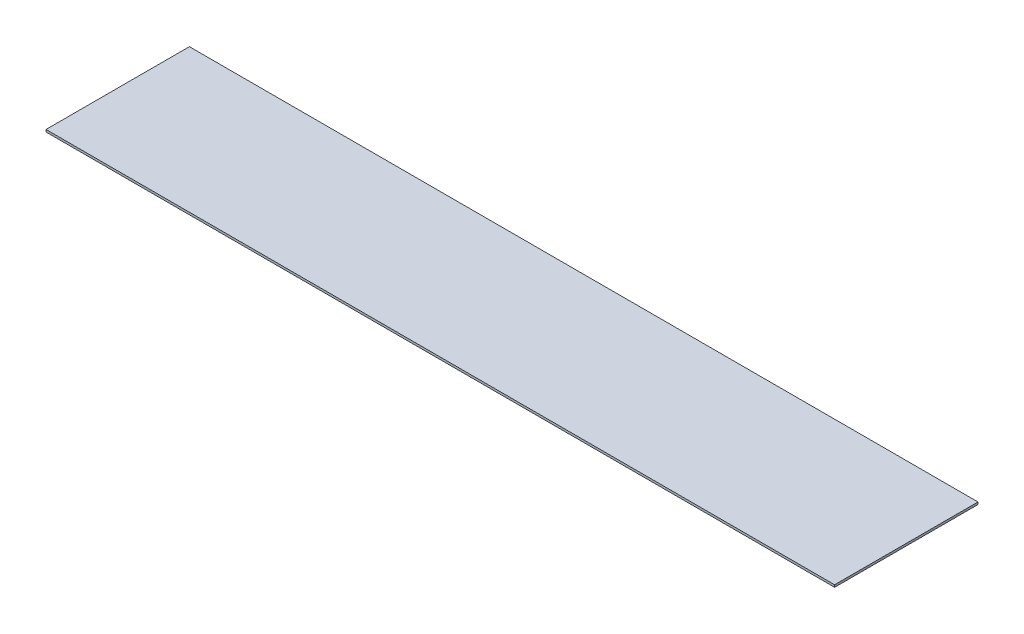
ISO-10303-21;
HEADER;
FILE_DESCRIPTION(('STEP AP214'),'2;1');
FILE_NAME('part.step','',(''),(''),'','','');
FILE_SCHEMA(('AUTOMOTIVE_DESIGN { 1 0 10303 214 1 1 1 1 }'));
ENDSEC;
DATA;
#1=APPLICATION_CONTEXT('core data for automotive mechanical design processes');
#2=APPLICATION_PROTOCOL_DEFINITION('international standard','automotive_design',2000,#1);
#3=PRODUCT_CONTEXT('',#1,'mechanical');
#4=PRODUCT('Part','Part','',(#3));
#5=PRODUCT_RELATED_PRODUCT_CATEGORY('part','',(#4));
#6=PRODUCT_DEFINITION_FORMATION('','',#4);
#7=PRODUCT_DEFINITION_CONTEXT('part definition',#1,'design');
#8=PRODUCT_DEFINITION('design','',#6,#7);
#9=PRODUCT_DEFINITION_SHAPE('','',#8);
#10=(LENGTH_UNIT() NAMED_UNIT(*) SI_UNIT(.MILLI.,.METRE.));
#11=(NAMED_UNIT(*) PLANE_ANGLE_UNIT() SI_UNIT($,.RADIAN.));
#12=(NAMED_UNIT(*) SI_UNIT($,.STERADIAN.) SOLID_ANGLE_UNIT());
#13=UNCERTAINTY_MEASURE_WITH_UNIT(LENGTH_MEASURE(1.E-05),#10,'distance_accuracy_value','');
#14=(GEOMETRIC_REPRESENTATION_CONTEXT(3) GLOBAL_UNCERTAINTY_ASSIGNED_CONTEXT((#13)) GLOBAL_UNIT_ASSIGNED_CONTEXT((#10,
#11,#12)) REPRESENTATION_CONTEXT('',''));
#15=CARTESIAN_POINT('',(0.,0.,0.));
#16=DIRECTION('',(0.,0.,1.));
#17=DIRECTION('',(1.,0.,0.));
#18=AXIS2_PLACEMENT_3D('',#15,#16,#17);
#19=CARTESIAN_POINT('',(0.,1.5875,0.));
#20=DIRECTION('',(1.,0.,0.));
#21=DIRECTION('',(0.,0.,-1.));
#22=AXIS2_PLACEMENT_3D('',#19,#20,#21);
#23=PLANE('',#22);
#24=DIRECTION('',(0.,0.,1.));
#25=VECTOR('',#24,1.);
#26=CARTESIAN_POINT('',(0.,0.,0.));
#27=LINE('',#26,#25);
#28=CARTESIAN_POINT('',(0.,0.,-101.6));
#29=VERTEX_POINT('',#28);
#30=CARTESIAN_POINT('',(0.,0.,0.));
#31=VERTEX_POINT('',#30);
#32=EDGE_CURVE('E100',#29,#31,#27,.T.);
#33=ORIENTED_EDGE('',*,*,#32,.T.);
#34=DIRECTION('',(0.,-1.,0.));
#35=VECTOR('',#34,1.);
#36=CARTESIAN_POINT('',(0.,1.5875,0.));
#37=LINE('',#36,#35);
#38=CARTESIAN_POINT('',(0.,1.5875,0.));
#39=VERTEX_POINT('',#38);
#40=EDGE_CURVE('E11',#39,#31,#37,.T.);
#41=ORIENTED_EDGE('',*,*,#40,.F.);
#42=DIRECTION('',(0.,0.,1.));
#43=VECTOR('',#42,1.);
#44=CARTESIAN_POINT('',(0.,1.5875,0.));
#45=LINE('',#44,#43);
#46=CARTESIAN_POINT('',(0.,1.5875,-101.6));
#47=VERTEX_POINT('',#46);
#48=EDGE_CURVE('E88',#47,#39,#45,.T.);
#49=ORIENTED_EDGE('',*,*,#48,.F.);
#50=DIRECTION('',(0.,-1.,0.));
#51=VECTOR('',#50,1.);
#52=CARTESIAN_POINT('',(0.,1.5875,-101.6));
#53=LINE('',#52,#51);
#54=EDGE_CURVE('E96',#47,#29,#53,.T.);
#55=ORIENTED_EDGE('',*,*,#54,.T.);
#56=EDGE_LOOP('',(#33,#41,#49,#55));
#57=FACE_BOUND('',#56,.T.);
#58=ADVANCED_FACE('F37',(#57),#23,.F.);
#59=CARTESIAN_POINT('',(0.,1.5875,0.));
#60=DIRECTION('',(0.,0.,-1.));
#61=DIRECTION('',(-1.,0.,0.));
#62=AXIS2_PLACEMENT_3D('',#59,#60,#61);
#63=PLANE('',#62);
#64=DIRECTION('',(1.,0.,0.));
#65=VECTOR('',#64,1.);
#66=CARTESIAN_POINT('',(0.,0.,0.));
#67=LINE('',#66,#65);
#68=CARTESIAN_POINT('',(558.8,0.,0.));
#69=VERTEX_POINT('',#68);
#70=EDGE_CURVE('E92',#31,#69,#67,.T.);
#71=ORIENTED_EDGE('',*,*,#70,.T.);
#72=DIRECTION('',(0.,-1.,0.));
#73=VECTOR('',#72,1.);
#74=CARTESIAN_POINT('',(558.8,1.5875,0.));
#75=LINE('',#74,#73);
#76=CARTESIAN_POINT('',(558.8,1.5875,0.));
#77=VERTEX_POINT('',#76);
#78=EDGE_CURVE('E45',#77,#69,#75,.T.);
#79=ORIENTED_EDGE('',*,*,#78,.F.);
#80=DIRECTION('',(1.,0.,0.));
#81=VECTOR('',#80,1.);
#82=CARTESIAN_POINT('',(0.,1.5875,0.));
#83=LINE('',#82,#81);
#84=EDGE_CURVE('E83',#39,#77,#83,.T.);
#85=ORIENTED_EDGE('',*,*,#84,.F.);
#86=ORIENTED_EDGE('',*,*,#40,.T.);
#87=EDGE_LOOP('',(#71,#79,#85,#86));
#88=FACE_BOUND('',#87,.T.);
#89=ADVANCED_FACE('F91',(#88),#63,.F.);
#90=CARTESIAN_POINT('',(558.8,1.5875,0.));
#91=DIRECTION('',(-1.,0.,0.));
#92=DIRECTION('',(0.,0.,1.));
#93=AXIS2_PLACEMENT_3D('',#90,#91,#92);
#94=PLANE('',#93);
#95=DIRECTION('',(0.,0.,-1.));
#96=VECTOR('',#95,1.);
#97=CARTESIAN_POINT('',(558.8,0.,0.));
#98=LINE('',#97,#96);
#99=CARTESIAN_POINT('',(558.8,0.,-101.6));
#100=VERTEX_POINT('',#99);
#101=EDGE_CURVE('E70',#69,#100,#98,.T.);
#102=ORIENTED_EDGE('',*,*,#101,.T.);
#103=DIRECTION('',(0.,-1.,0.));
#104=VECTOR('',#103,1.);
#105=CARTESIAN_POINT('',(558.8,1.5875,-101.6));
#106=LINE('',#105,#104);
#107=CARTESIAN_POINT('',(558.8,1.5875,-101.6));
#108=VERTEX_POINT('',#107);
#109=EDGE_CURVE('E93',#108,#100,#106,.T.);
#110=ORIENTED_EDGE('',*,*,#109,.F.);
#111=DIRECTION('',(0.,0.,-1.));
#112=VECTOR('',#111,1.);
#113=CARTESIAN_POINT('',(558.8,1.5875,0.));
#114=LINE('',#113,#112);
#115=EDGE_CURVE('E86',#77,#108,#114,.T.);
#116=ORIENTED_EDGE('',*,*,#115,.F.);
#117=ORIENTED_EDGE('',*,*,#78,.T.);
#118=EDGE_LOOP('',(#102,#110,#116,#117));
#119=FACE_BOUND('',#118,.T.);
#120=ADVANCED_FACE('F94',(#119),#94,.F.);
#121=CARTESIAN_POINT('',(0.,1.5875,-101.6));
#122=DIRECTION('',(0.,0.,1.));
#123=DIRECTION('',(1.,0.,0.));
#124=AXIS2_PLACEMENT_3D('',#121,#122,#123);
#125=PLANE('',#124);
#126=DIRECTION('',(-1.,0.,0.));
#127=VECTOR('',#126,1.);
#128=CARTESIAN_POINT('',(0.,0.,-101.6));
#129=LINE('',#128,#127);
#130=EDGE_CURVE('E76',#100,#29,#129,.T.);
#131=ORIENTED_EDGE('',*,*,#130,.T.);
#132=ORIENTED_EDGE('',*,*,#54,.F.);
#133=DIRECTION('',(-1.,0.,0.));
#134=VECTOR('',#133,1.);
#135=CARTESIAN_POINT('',(0.,1.5875,-101.6));
#136=LINE('',#135,#134);
#137=EDGE_CURVE('E53',#108,#47,#136,.T.);
#138=ORIENTED_EDGE('',*,*,#137,.F.);
#139=ORIENTED_EDGE('',*,*,#109,.T.);
#140=EDGE_LOOP('',(#131,#132,#138,#139));
#141=FACE_BOUND('',#140,.T.);
#142=ADVANCED_FACE('F107',(#141),#125,.F.);
#143=CARTESIAN_POINT('',(0.,1.5875,0.));
#144=DIRECTION('',(0.,-1.,0.));
#145=DIRECTION('',(0.,0.,-1.));
#146=AXIS2_PLACEMENT_3D('',#143,#144,#145);
#147=PLANE('',#146);
#148=ORIENTED_EDGE('',*,*,#48,.T.);
#149=ORIENTED_EDGE('',*,*,#84,.T.);
#150=ORIENTED_EDGE('',*,*,#115,.T.);
#151=ORIENTED_EDGE('',*,*,#137,.T.);
#152=EDGE_LOOP('',(#148,#149,#150,#151));
#153=FACE_BOUND('',#152,.T.);
#154=ADVANCED_FACE('F84',(#153),#147,.F.);
#155=CARTESIAN_POINT('',(0.,0.,0.));
#156=DIRECTION('',(0.,-1.,0.));
#157=DIRECTION('',(0.,0.,-1.));
#158=AXIS2_PLACEMENT_3D('',#155,#156,#157);
#159=PLANE('',#158);
#160=ORIENTED_EDGE('',*,*,#32,.F.);
#161=ORIENTED_EDGE('',*,*,#130,.F.);
#162=ORIENTED_EDGE('',*,*,#101,.F.);
#163=ORIENTED_EDGE('',*,*,#70,.F.);
#164=EDGE_LOOP('',(#160,#161,#162,#163));
#165=FACE_BOUND('',#164,.T.);
#166=ADVANCED_FACE('F110',(#165),#159,.T.);
#167=CLOSED_SHELL('',(#58,#89,#120,#142,#154,#166));
#168=MANIFOLD_SOLID_BREP('B2',#167);
#169=ADVANCED_BREP_SHAPE_REPRESENTATION('',(#18,#168),#14);
#170=SHAPE_DEFINITION_REPRESENTATION(#9,#169);
ENDSEC;
END-ISO-10303-21;
